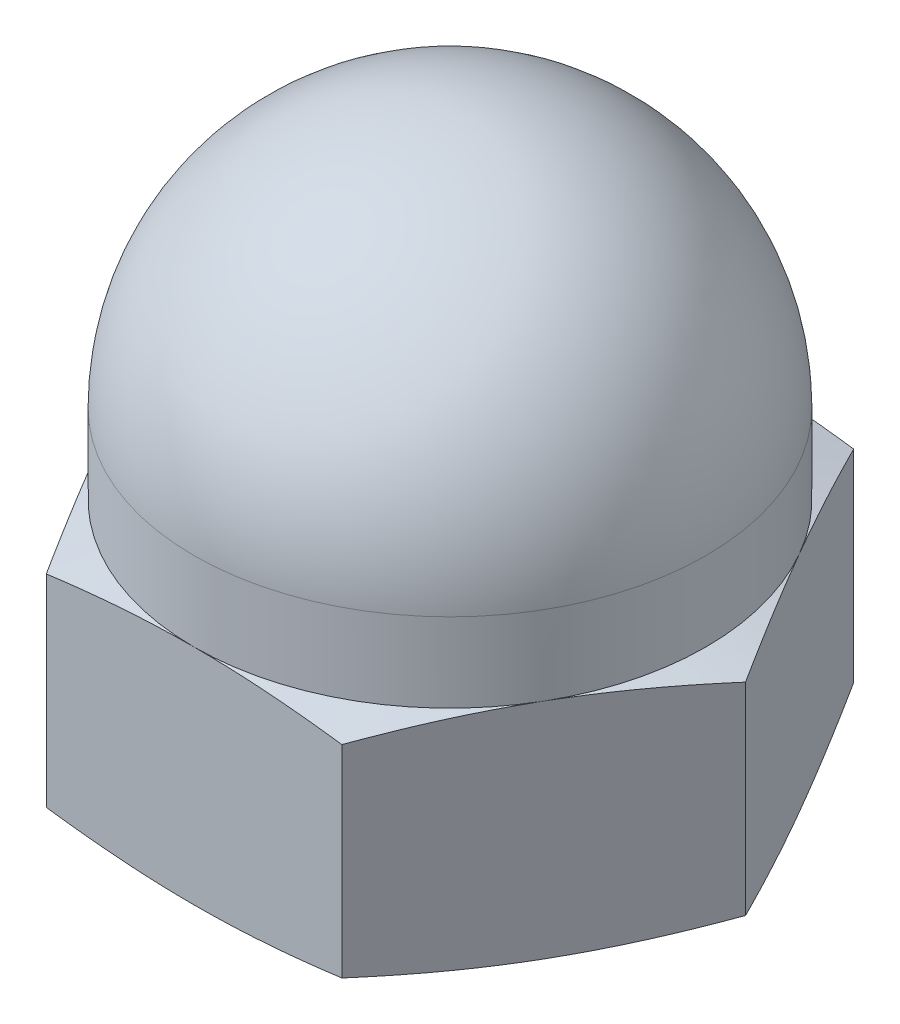
ISO-10303-21;
HEADER;
FILE_DESCRIPTION(('STEP AP214'),'2;1');
FILE_NAME('part.step','',(''),(''),'','','');
FILE_SCHEMA(('AUTOMOTIVE_DESIGN { 1 0 10303 214 1 1 1 1 }'));
ENDSEC;
DATA;
#1=APPLICATION_CONTEXT('core data for automotive mechanical design processes');
#2=APPLICATION_PROTOCOL_DEFINITION('international standard','automotive_design',2000,#1);
#3=PRODUCT_CONTEXT('',#1,'mechanical');
#4=PRODUCT('Part','Part','',(#3));
#5=PRODUCT_RELATED_PRODUCT_CATEGORY('part','',(#4));
#6=PRODUCT_DEFINITION_FORMATION('','',#4);
#7=PRODUCT_DEFINITION_CONTEXT('part definition',#1,'design');
#8=PRODUCT_DEFINITION('design','',#6,#7);
#9=PRODUCT_DEFINITION_SHAPE('','',#8);
#10=(LENGTH_UNIT() NAMED_UNIT(*) SI_UNIT(.MILLI.,.METRE.));
#11=(NAMED_UNIT(*) PLANE_ANGLE_UNIT() SI_UNIT($,.RADIAN.));
#12=(NAMED_UNIT(*) SI_UNIT($,.STERADIAN.) SOLID_ANGLE_UNIT());
#13=UNCERTAINTY_MEASURE_WITH_UNIT(LENGTH_MEASURE(1.E-05),#10,'distance_accuracy_value','');
#14=(GEOMETRIC_REPRESENTATION_CONTEXT(3) GLOBAL_UNCERTAINTY_ASSIGNED_CONTEXT((#13)) GLOBAL_UNIT_ASSIGNED_CONTEXT((#10,
#11,#12)) REPRESENTATION_CONTEXT('',''));
#15=CARTESIAN_POINT('',(0.,0.,0.));
#16=DIRECTION('',(0.,0.,1.));
#17=DIRECTION('',(1.,0.,0.));
#18=AXIS2_PLACEMENT_3D('',#15,#16,#17);
#19=CARTESIAN_POINT('',(0.,0.,0.));
#20=DIRECTION('',(0.,1.,0.));
#21=DIRECTION('',(1.,0.,0.));
#22=AXIS2_PLACEMENT_3D('',#19,#20,#21);
#23=PLANE('',#22);
#24=CARTESIAN_POINT('',(0.,0.,0.));
#25=DIRECTION('',(0.,1.,0.));
#26=DIRECTION('',(1.,0.,0.));
#27=AXIS2_PLACEMENT_3D('',#24,#25,#26);
#28=CIRCLE('',#27,1.2295);
#29=CARTESIAN_POINT('',(-1.2295,0.,0.));
#30=VERTEX_POINT('',#29);
#31=EDGE_CURVE('E428',#30,#30,#28,.T.);
#32=ORIENTED_EDGE('',*,*,#31,.T.);
#33=EDGE_LOOP('',(#32));
#34=FACE_BOUND('',#33,.T.);
#35=CARTESIAN_POINT('',(0.,0.,0.));
#36=DIRECTION('',(0.,-1.,0.));
#37=DIRECTION('',(-1.,0.,0.));
#38=AXIS2_PLACEMENT_3D('',#35,#36,#37);
#39=CIRCLE('',#38,2.75);
#40=CARTESIAN_POINT('',(2.38156986040721,0.,1.375));
#41=VERTEX_POINT('',#40);
#42=CARTESIAN_POINT('',(0.,0.,2.75));
#43=VERTEX_POINT('',#42);
#44=EDGE_CURVE('E366',#41,#43,#39,.T.);
#45=ORIENTED_EDGE('',*,*,#44,.T.);
#46=CARTESIAN_POINT('',(0.,0.,0.));
#47=DIRECTION('',(0.,-1.,0.));
#48=DIRECTION('',(-1.,0.,0.));
#49=AXIS2_PLACEMENT_3D('',#46,#47,#48);
#50=CIRCLE('',#49,2.75);
#51=CARTESIAN_POINT('',(-2.38156986040721,0.,1.375));
#52=VERTEX_POINT('',#51);
#53=EDGE_CURVE('E298',#43,#52,#50,.T.);
#54=ORIENTED_EDGE('',*,*,#53,.T.);
#55=CARTESIAN_POINT('',(0.,0.,0.));
#56=DIRECTION('',(0.,-1.,0.));
#57=DIRECTION('',(-1.,0.,0.));
#58=AXIS2_PLACEMENT_3D('',#55,#56,#57);
#59=CIRCLE('',#58,2.75);
#60=CARTESIAN_POINT('',(-2.38156986040721,0.,-1.375));
#61=VERTEX_POINT('',#60);
#62=EDGE_CURVE('E213',#52,#61,#59,.T.);
#63=ORIENTED_EDGE('',*,*,#62,.T.);
#64=CARTESIAN_POINT('',(0.,0.,0.));
#65=DIRECTION('',(0.,-1.,0.));
#66=DIRECTION('',(-1.,0.,0.));
#67=AXIS2_PLACEMENT_3D('',#64,#65,#66);
#68=CIRCLE('',#67,2.75);
#69=CARTESIAN_POINT('',(0.,0.,-2.75));
#70=VERTEX_POINT('',#69);
#71=EDGE_CURVE('E184',#61,#70,#68,.T.);
#72=ORIENTED_EDGE('',*,*,#71,.T.);
#73=CARTESIAN_POINT('',(0.,0.,0.));
#74=DIRECTION('',(0.,-1.,0.));
#75=DIRECTION('',(-1.,0.,0.));
#76=AXIS2_PLACEMENT_3D('',#73,#74,#75);
#77=CIRCLE('',#76,2.75);
#78=CARTESIAN_POINT('',(2.38156986040721,0.,-1.375));
#79=VERTEX_POINT('',#78);
#80=EDGE_CURVE('E354',#70,#79,#77,.T.);
#81=ORIENTED_EDGE('',*,*,#80,.T.);
#82=CARTESIAN_POINT('',(0.,0.,0.));
#83=DIRECTION('',(0.,-1.,0.));
#84=DIRECTION('',(-1.,0.,0.));
#85=AXIS2_PLACEMENT_3D('',#82,#83,#84);
#86=CIRCLE('',#85,2.75);
#87=EDGE_CURVE('E273',#79,#41,#86,.T.);
#88=ORIENTED_EDGE('',*,*,#87,.T.);
#89=EDGE_LOOP('',(#45,#54,#63,#72,#81,#88));
#90=FACE_BOUND('',#89,.T.);
#91=ADVANCED_FACE('F16',(#34,#90),#23,.F.);
#92=CARTESIAN_POINT('',(-1.58771324027147,0.,2.75));
#93=DIRECTION('',(0.,0.,1.));
#94=DIRECTION('',(1.,0.,0.));
#95=AXIS2_PLACEMENT_3D('',#92,#93,#94);
#96=PLANE('',#95);
#97=CARTESIAN_POINT('',(0.,2.4,2.75));
#98=CARTESIAN_POINT('',(-0.736860279185574,2.4,2.75000000000001));
#99=CARTESIAN_POINT('',(-1.58771324027146,2.2860073180997,2.75));
#100=(BOUNDED_CURVE() B_SPLINE_CURVE(2,(#97,#98,#99),.UNSPECIFIED.,.F.,
.F.) B_SPLINE_CURVE_WITH_KNOTS((3,3),(0.159270877483225,0.31854175496645),
.UNSPECIFIED.) CURVE() GEOMETRIC_REPRESENTATION_ITEM() RATIONAL_B_SPLINE_CURVE((1.,
1.03795484930204,1.)) REPRESENTATION_ITEM(''));
#101=CARTESIAN_POINT('',(0.,2.4,2.75));
#102=VERTEX_POINT('',#101);
#103=CARTESIAN_POINT('',(-1.58771324027147,2.2860073180997,2.75));
#104=VERTEX_POINT('',#103);
#105=EDGE_CURVE('E345',#102,#104,#100,.T.);
#106=ORIENTED_EDGE('',*,*,#105,.T.);
#107=DIRECTION('',(0.,1.,0.));
#108=VECTOR('',#107,1.);
#109=CARTESIAN_POINT('',(-1.58771324027147,0.,2.75));
#110=LINE('',#109,#108);
#111=CARTESIAN_POINT('',(-1.58771324027147,0.113992681900296,2.75));
#112=VERTEX_POINT('',#111);
#113=EDGE_CURVE('E150',#112,#104,#110,.T.);
#114=ORIENTED_EDGE('',*,*,#113,.F.);
#115=CARTESIAN_POINT('',(-1.58771324027146,0.113992681900296,2.75));
#116=CARTESIAN_POINT('',(-0.736860279185583,0.,2.75000000000001));
#117=CARTESIAN_POINT('',(0.,0.,2.75));
#118=(BOUNDED_CURVE() B_SPLINE_CURVE(2,(#115,#116,#117),.UNSPECIFIED.,.F.,
.F.) B_SPLINE_CURVE_WITH_KNOTS((3,3),(0.,0.159270877483225),
.UNSPECIFIED.) CURVE() GEOMETRIC_REPRESENTATION_ITEM() RATIONAL_B_SPLINE_CURVE((1.,
1.03795484930203,1.)) REPRESENTATION_ITEM(''));
#119=EDGE_CURVE('E142',#112,#43,#118,.T.);
#120=ORIENTED_EDGE('',*,*,#119,.T.);
#121=CARTESIAN_POINT('',(0.,0.,2.75));
#122=CARTESIAN_POINT('',(0.736860279185586,0.,2.75));
#123=CARTESIAN_POINT('',(1.58771324027146,0.113992681900296,2.75));
#124=(BOUNDED_CURVE() B_SPLINE_CURVE(2,(#121,#122,#123),.UNSPECIFIED.,.F.,
.F.) B_SPLINE_CURVE_WITH_KNOTS((3,3),(0.159270877483225,0.31854175496645),
.UNSPECIFIED.) CURVE() GEOMETRIC_REPRESENTATION_ITEM() RATIONAL_B_SPLINE_CURVE((1.,
1.03795484930204,1.)) REPRESENTATION_ITEM(''));
#125=CARTESIAN_POINT('',(1.58771324027148,0.113992681900296,2.75));
#126=VERTEX_POINT('',#125);
#127=EDGE_CURVE('E373',#43,#126,#124,.T.);
#128=ORIENTED_EDGE('',*,*,#127,.T.);
#129=DIRECTION('',(0.,1.,0.));
#130=VECTOR('',#129,1.);
#131=CARTESIAN_POINT('',(1.58771324027147,0.,2.75));
#132=LINE('',#131,#130);
#133=CARTESIAN_POINT('',(1.58771324027148,2.2860073180997,2.75));
#134=VERTEX_POINT('',#133);
#135=EDGE_CURVE('E11',#126,#134,#132,.T.);
#136=ORIENTED_EDGE('',*,*,#135,.T.);
#137=CARTESIAN_POINT('',(1.58771324027146,2.2860073180997,2.75));
#138=CARTESIAN_POINT('',(0.736860279185576,2.4,2.75));
#139=CARTESIAN_POINT('',(0.,2.4,2.75));
#140=(BOUNDED_CURVE() B_SPLINE_CURVE(2,(#137,#138,#139),.UNSPECIFIED.,.F.,
.F.) B_SPLINE_CURVE_WITH_KNOTS((3,3),(0.,0.159270877483225),
.UNSPECIFIED.) CURVE() GEOMETRIC_REPRESENTATION_ITEM() RATIONAL_B_SPLINE_CURVE((1.,
1.03795484930205,1.)) REPRESENTATION_ITEM(''));
#141=EDGE_CURVE('E221',#134,#102,#140,.T.);
#142=ORIENTED_EDGE('',*,*,#141,.T.);
#143=EDGE_LOOP('',(#106,#114,#120,#128,#136,#142));
#144=FACE_BOUND('',#143,.T.);
#145=ADVANCED_FACE('F497',(#144),#96,.T.);
#146=CARTESIAN_POINT('',(1.58771324027147,0.,2.75));
#147=DIRECTION('',(0.866025403784439,0.,0.5));
#148=DIRECTION('',(0.,-1.,0.));
#149=AXIS2_PLACEMENT_3D('',#146,#147,#148);
#150=PLANE('',#149);
#151=CARTESIAN_POINT('',(2.38156986040721,2.4,1.375));
#152=CARTESIAN_POINT('',(2.01313972081441,2.4,2.01313972081442));
#153=CARTESIAN_POINT('',(1.58771324027148,2.2860073180997,2.75));
#154=(BOUNDED_CURVE() B_SPLINE_CURVE(2,(#151,#152,#153),.UNSPECIFIED.,.F.,
.F.) B_SPLINE_CURVE_WITH_KNOTS((3,3),(0.159270877483225,0.31854175496645),
.UNSPECIFIED.) CURVE() GEOMETRIC_REPRESENTATION_ITEM() RATIONAL_B_SPLINE_CURVE((1.,
1.03795484930203,1.)) REPRESENTATION_ITEM(''));
#155=CARTESIAN_POINT('',(2.38156986040721,2.4,1.375));
#156=VERTEX_POINT('',#155);
#157=EDGE_CURVE('E227',#156,#134,#154,.T.);
#158=ORIENTED_EDGE('',*,*,#157,.T.);
#159=ORIENTED_EDGE('',*,*,#135,.F.);
#160=CARTESIAN_POINT('',(1.58771324027148,0.113992681900296,2.75));
#161=CARTESIAN_POINT('',(2.01313972081442,0.,2.01313972081441));
#162=CARTESIAN_POINT('',(2.38156986040721,0.,1.375));
#163=(BOUNDED_CURVE() B_SPLINE_CURVE(2,(#160,#161,#162),.UNSPECIFIED.,.F.,
.F.) B_SPLINE_CURVE_WITH_KNOTS((3,3),(0.,0.159270877483225),
.UNSPECIFIED.) CURVE() GEOMETRIC_REPRESENTATION_ITEM() RATIONAL_B_SPLINE_CURVE((1.,
1.03795484930204,1.)) REPRESENTATION_ITEM(''));
#164=EDGE_CURVE('E325',#126,#41,#163,.T.);
#165=ORIENTED_EDGE('',*,*,#164,.T.);
#166=CARTESIAN_POINT('',(2.38156986040721,0.,1.375));
#167=CARTESIAN_POINT('',(2.75,0.,0.736860279185588));
#168=CARTESIAN_POINT('',(3.17542648054294,0.113992681900296,0.));
#169=(BOUNDED_CURVE() B_SPLINE_CURVE(2,(#166,#167,#168),.UNSPECIFIED.,.F.,
.F.) B_SPLINE_CURVE_WITH_KNOTS((3,3),(0.159270877483225,0.31854175496645),
.UNSPECIFIED.) CURVE() GEOMETRIC_REPRESENTATION_ITEM() RATIONAL_B_SPLINE_CURVE((1.,
1.03795484930205,1.)) REPRESENTATION_ITEM(''));
#170=CARTESIAN_POINT('',(3.17542648054294,0.113992681900296,0.));
#171=VERTEX_POINT('',#170);
#172=EDGE_CURVE('E264',#41,#171,#169,.T.);
#173=ORIENTED_EDGE('',*,*,#172,.T.);
#174=DIRECTION('',(0.,1.,0.));
#175=VECTOR('',#174,1.);
#176=CARTESIAN_POINT('',(3.17542648054294,0.,0.));
#177=LINE('',#176,#175);
#178=CARTESIAN_POINT('',(3.17542648054294,2.2860073180997,0.));
#179=VERTEX_POINT('',#178);
#180=EDGE_CURVE('E377',#171,#179,#177,.T.);
#181=ORIENTED_EDGE('',*,*,#180,.T.);
#182=CARTESIAN_POINT('',(3.17542648054294,2.2860073180997,0.));
#183=CARTESIAN_POINT('',(2.75000000000001,2.4,0.736860279185583));
#184=CARTESIAN_POINT('',(2.38156986040721,2.4,1.375));
#185=(BOUNDED_CURVE() B_SPLINE_CURVE(2,(#182,#183,#184),.UNSPECIFIED.,.F.,
.F.) B_SPLINE_CURVE_WITH_KNOTS((3,3),(0.,0.159270877483225),
.UNSPECIFIED.) CURVE() GEOMETRIC_REPRESENTATION_ITEM() RATIONAL_B_SPLINE_CURVE((1.,
1.03795484930204,1.)) REPRESENTATION_ITEM(''));
#186=EDGE_CURVE('E194',#179,#156,#185,.T.);
#187=ORIENTED_EDGE('',*,*,#186,.T.);
#188=EDGE_LOOP('',(#158,#159,#165,#173,#181,#187));
#189=FACE_BOUND('',#188,.T.);
#190=ADVANCED_FACE('F503',(#189),#150,.T.);
#191=CARTESIAN_POINT('',(0.,3.25,0.));
#192=DIRECTION('',(0.,1.,0.));
#193=DIRECTION('',(0.,0.,-1.));
#194=AXIS2_PLACEMENT_3D('',#191,#192,#193);
#195=SPHERICAL_SURFACE('',#194,2.75);
#196=CARTESIAN_POINT('',(0.,3.25,0.));
#197=DIRECTION('',(0.,1.,0.));
#198=DIRECTION('',(1.,0.,0.));
#199=AXIS2_PLACEMENT_3D('',#196,#197,#198);
#200=CIRCLE('',#199,2.75);
#201=CARTESIAN_POINT('',(2.75,3.25,0.));
#202=VERTEX_POINT('',#201);
#203=CARTESIAN_POINT('',(0.,3.25,2.75));
#204=VERTEX_POINT('',#203);
#205=EDGE_CURVE('E214',#202,#204,#200,.T.);
#206=ORIENTED_EDGE('',*,*,#205,.T.);
#207=CARTESIAN_POINT('',(0.,3.25,0.));
#208=DIRECTION('',(1.,0.,0.));
#209=DIRECTION('',(0.,0.,1.));
#210=AXIS2_PLACEMENT_3D('',#207,#208,#209);
#211=CIRCLE('',#210,2.75);
#212=CARTESIAN_POINT('',(0.,6.,0.));
#213=VERTEX_POINT('',#212);
#214=EDGE_CURVE('E27',#213,#204,#211,.T.);
#215=ORIENTED_EDGE('',*,*,#214,.F.);
#216=ORIENTED_EDGE('',*,*,#214,.T.);
#217=CARTESIAN_POINT('',(0.,3.25,0.));
#218=DIRECTION('',(0.,1.,0.));
#219=DIRECTION('',(1.,0.,0.));
#220=AXIS2_PLACEMENT_3D('',#217,#218,#219);
#221=CIRCLE('',#220,2.75);
#222=EDGE_CURVE('E247',#204,#202,#221,.T.);
#223=ORIENTED_EDGE('',*,*,#222,.T.);
#224=EDGE_LOOP('',(#206,#215,#216,#223));
#225=FACE_BOUND('',#224,.T.);
#226=ADVANCED_FACE('F521',(#225),#195,.T.);
#227=CARTESIAN_POINT('',(0.,2.825,0.));
#228=DIRECTION('',(0.,1.,0.));
#229=DIRECTION('',(-1.,0.,0.));
#230=AXIS2_PLACEMENT_3D('',#227,#228,#229);
#231=CYLINDRICAL_SURFACE('',#230,2.75);
#232=ORIENTED_EDGE('',*,*,#205,.F.);
#233=DIRECTION('',(0.,-1.,0.));
#234=VECTOR('',#233,1.);
#235=CARTESIAN_POINT('',(2.75,2.825,0.));
#236=LINE('',#235,#234);
#237=CARTESIAN_POINT('',(2.75,2.4,0.));
#238=VERTEX_POINT('',#237);
#239=EDGE_CURVE('E219',#202,#238,#236,.T.);
#240=ORIENTED_EDGE('',*,*,#239,.T.);
#241=CARTESIAN_POINT('',(0.,2.4,0.));
#242=DIRECTION('',(0.,-1.,0.));
#243=DIRECTION('',(-1.,0.,0.));
#244=AXIS2_PLACEMENT_3D('',#241,#242,#243);
#245=CIRCLE('',#244,2.75);
#246=CARTESIAN_POINT('',(2.38156986040721,2.4,-1.375));
#247=VERTEX_POINT('',#246);
#248=EDGE_CURVE('E286',#247,#238,#245,.T.);
#249=ORIENTED_EDGE('',*,*,#248,.F.);
#250=CARTESIAN_POINT('',(0.,2.4,0.));
#251=DIRECTION('',(0.,-1.,0.));
#252=DIRECTION('',(-1.,0.,0.));
#253=AXIS2_PLACEMENT_3D('',#250,#251,#252);
#254=CIRCLE('',#253,2.75);
#255=CARTESIAN_POINT('',(0.,2.4,-2.75));
#256=VERTEX_POINT('',#255);
#257=EDGE_CURVE('E207',#256,#247,#254,.T.);
#258=ORIENTED_EDGE('',*,*,#257,.F.);
#259=CARTESIAN_POINT('',(0.,2.4,0.));
#260=DIRECTION('',(0.,-1.,0.));
#261=DIRECTION('',(-1.,0.,0.));
#262=AXIS2_PLACEMENT_3D('',#259,#260,#261);
#263=CIRCLE('',#262,2.75);
#264=CARTESIAN_POINT('',(-2.3815698604072,2.4,-1.375));
#265=VERTEX_POINT('',#264);
#266=EDGE_CURVE('E191',#265,#256,#263,.T.);
#267=ORIENTED_EDGE('',*,*,#266,.F.);
#268=CARTESIAN_POINT('',(0.,2.4,0.));
#269=DIRECTION('',(0.,-1.,0.));
#270=DIRECTION('',(-1.,0.,0.));
#271=AXIS2_PLACEMENT_3D('',#268,#269,#270);
#272=CIRCLE('',#271,2.75);
#273=CARTESIAN_POINT('',(-2.38156986040721,2.4,1.375));
#274=VERTEX_POINT('',#273);
#275=EDGE_CURVE('E389',#274,#265,#272,.T.);
#276=ORIENTED_EDGE('',*,*,#275,.F.);
#277=CARTESIAN_POINT('',(0.,2.4,0.));
#278=DIRECTION('',(0.,-1.,0.));
#279=DIRECTION('',(-1.,0.,0.));
#280=AXIS2_PLACEMENT_3D('',#277,#278,#279);
#281=CIRCLE('',#280,2.75);
#282=EDGE_CURVE('E416',#102,#274,#281,.T.);
#283=ORIENTED_EDGE('',*,*,#282,.F.);
#284=CARTESIAN_POINT('',(0.,2.4,0.));
#285=DIRECTION('',(0.,-1.,0.));
#286=DIRECTION('',(-1.,0.,0.));
#287=AXIS2_PLACEMENT_3D('',#284,#285,#286);
#288=CIRCLE('',#287,2.75);
#289=EDGE_CURVE('E263',#156,#102,#288,.T.);
#290=ORIENTED_EDGE('',*,*,#289,.F.);
#291=CARTESIAN_POINT('',(0.,2.4,0.));
#292=DIRECTION('',(0.,-1.,0.));
#293=DIRECTION('',(-1.,0.,0.));
#294=AXIS2_PLACEMENT_3D('',#291,#292,#293);
#295=CIRCLE('',#294,2.75);
#296=EDGE_CURVE('E228',#238,#156,#295,.T.);
#297=ORIENTED_EDGE('',*,*,#296,.F.);
#298=ORIENTED_EDGE('',*,*,#239,.F.);
#299=ORIENTED_EDGE('',*,*,#222,.F.);
#300=EDGE_LOOP('',(#232,#240,#249,#258,#267,#276,#283,#290,#297,#298,#299));
#301=FACE_BOUND('',#300,.T.);
#302=ADVANCED_FACE('F517',(#301),#231,.T.);
#303=CARTESIAN_POINT('',(0.,4.5,0.));
#304=DIRECTION('',(0.,-1.,0.));
#305=DIRECTION('',(0.,0.,-1.));
#306=AXIS2_PLACEMENT_3D('',#303,#304,#305);
#307=PLANE('',#306);
#308=CARTESIAN_POINT('',(0.,4.5,0.));
#309=DIRECTION('',(0.,-1.,0.));
#310=DIRECTION('',(1.,0.,0.));
#311=AXIS2_PLACEMENT_3D('',#308,#309,#310);
#312=CIRCLE('',#311,1.2295);
#313=CARTESIAN_POINT('',(-1.2295,4.5,0.));
#314=VERTEX_POINT('',#313);
#315=EDGE_CURVE('E220',#314,#314,#312,.T.);
#316=ORIENTED_EDGE('',*,*,#315,.T.);
#317=EDGE_LOOP('',(#316));
#318=FACE_BOUND('',#317,.T.);
#319=ADVANCED_FACE('F520',(#318),#307,.T.);
#320=CARTESIAN_POINT('',(0.,2.25,0.));
#321=DIRECTION('',(0.,-1.,0.));
#322=DIRECTION('',(1.,0.,0.));
#323=AXIS2_PLACEMENT_3D('',#320,#321,#322);
#324=CYLINDRICAL_SURFACE('',#323,1.2295);
#325=ORIENTED_EDGE('',*,*,#31,.F.);
#326=DIRECTION('',(0.,1.,0.));
#327=VECTOR('',#326,1.);
#328=CARTESIAN_POINT('',(-1.2295,2.25,0.));
#329=LINE('',#328,#327);
#330=EDGE_CURVE('E20',#30,#314,#329,.T.);
#331=ORIENTED_EDGE('',*,*,#330,.T.);
#332=ORIENTED_EDGE('',*,*,#315,.F.);
#333=ORIENTED_EDGE('',*,*,#330,.F.);
#334=EDGE_LOOP('',(#325,#331,#332,#333));
#335=FACE_BOUND('',#334,.T.);
#336=ADVANCED_FACE('F529',(#335),#324,.F.);
#337=CARTESIAN_POINT('',(3.17542648054294,0.,0.));
#338=DIRECTION('',(0.866025403784438,0.,-0.5));
#339=DIRECTION('',(0.,-1.,0.));
#340=AXIS2_PLACEMENT_3D('',#337,#338,#339);
#341=PLANE('',#340);
#342=CARTESIAN_POINT('',(1.58771324027147,2.2860073180997,-2.75));
#343=CARTESIAN_POINT('',(2.01313972081441,2.4,-2.01313972081442));
#344=CARTESIAN_POINT('',(2.38156986040721,2.4,-1.375));
#345=(BOUNDED_CURVE() B_SPLINE_CURVE(2,(#342,#343,#344),.UNSPECIFIED.,.F.,
.F.) B_SPLINE_CURVE_WITH_KNOTS((3,3),(0.,0.159270877483225),
.UNSPECIFIED.) CURVE() GEOMETRIC_REPRESENTATION_ITEM() RATIONAL_B_SPLINE_CURVE((1.,
1.03795484930206,1.)) REPRESENTATION_ITEM(''));
#346=CARTESIAN_POINT('',(1.58771324027147,2.2860073180997,-2.75));
#347=VERTEX_POINT('',#346);
#348=EDGE_CURVE('E198',#347,#247,#345,.T.);
#349=ORIENTED_EDGE('',*,*,#348,.T.);
#350=CARTESIAN_POINT('',(2.38156986040721,2.4,-1.375));
#351=CARTESIAN_POINT('',(2.75,2.4,-0.736860279185588));
#352=CARTESIAN_POINT('',(3.17542648054294,2.2860073180997,0.));
#353=(BOUNDED_CURVE() B_SPLINE_CURVE(2,(#350,#351,#352),.UNSPECIFIED.,.F.,
.F.) B_SPLINE_CURVE_WITH_KNOTS((3,3),(0.159270877483225,0.318541754966451),
.UNSPECIFIED.) CURVE() GEOMETRIC_REPRESENTATION_ITEM() RATIONAL_B_SPLINE_CURVE((1.,
1.03795484930205,1.)) REPRESENTATION_ITEM(''));
#354=EDGE_CURVE('E280',#247,#179,#353,.T.);
#355=ORIENTED_EDGE('',*,*,#354,.T.);
#356=ORIENTED_EDGE('',*,*,#180,.F.);
#357=CARTESIAN_POINT('',(3.17542648054294,0.113992681900296,0.));
#358=CARTESIAN_POINT('',(2.75,0.,-0.736860279185591));
#359=CARTESIAN_POINT('',(2.38156986040721,0.,-1.375));
#360=(BOUNDED_CURVE() B_SPLINE_CURVE(2,(#357,#358,#359),.UNSPECIFIED.,.F.,
.F.) B_SPLINE_CURVE_WITH_KNOTS((3,3),(0.,0.159270877483226),
.UNSPECIFIED.) CURVE() GEOMETRIC_REPRESENTATION_ITEM() RATIONAL_B_SPLINE_CURVE((1.,
1.03795484930203,1.)) REPRESENTATION_ITEM(''));
#361=EDGE_CURVE('E274',#171,#79,#360,.T.);
#362=ORIENTED_EDGE('',*,*,#361,.T.);
#363=CARTESIAN_POINT('',(2.38156986040721,0.,-1.375));
#364=CARTESIAN_POINT('',(2.01313972081441,0.,-2.01313972081441));
#365=CARTESIAN_POINT('',(1.58771324027147,0.113992681900296,-2.75));
#366=(BOUNDED_CURVE() B_SPLINE_CURVE(2,(#363,#364,#365),.UNSPECIFIED.,.F.,
.F.) B_SPLINE_CURVE_WITH_KNOTS((3,3),(0.159270877483226,0.318541754966451),
.UNSPECIFIED.) CURVE() GEOMETRIC_REPRESENTATION_ITEM() RATIONAL_B_SPLINE_CURVE((1.,
1.03795484930203,1.)) REPRESENTATION_ITEM(''));
#367=CARTESIAN_POINT('',(1.58771324027147,0.113992681900296,-2.75));
#368=VERTEX_POINT('',#367);
#369=EDGE_CURVE('E336',#79,#368,#366,.T.);
#370=ORIENTED_EDGE('',*,*,#369,.T.);
#371=DIRECTION('',(0.,1.,0.));
#372=VECTOR('',#371,1.);
#373=CARTESIAN_POINT('',(1.58771324027147,0.,-2.75));
#374=LINE('',#373,#372);
#375=EDGE_CURVE('E355',#368,#347,#374,.T.);
#376=ORIENTED_EDGE('',*,*,#375,.T.);
#377=EDGE_LOOP('',(#349,#355,#356,#362,#370,#376));
#378=FACE_BOUND('',#377,.T.);
#379=ADVANCED_FACE('F472',(#378),#341,.T.);
#380=CARTESIAN_POINT('',(-3.17542648054294,0.,0.));
#381=DIRECTION('',(-0.866025403784438,0.,0.5));
#382=DIRECTION('',(0.,1.,0.));
#383=AXIS2_PLACEMENT_3D('',#380,#381,#382);
#384=PLANE('',#383);
#385=CARTESIAN_POINT('',(-1.58771324027147,2.2860073180997,2.75));
#386=CARTESIAN_POINT('',(-2.01313972081442,2.4,2.01313972081441));
#387=CARTESIAN_POINT('',(-2.38156986040721,2.4,1.375));
#388=(BOUNDED_CURVE() B_SPLINE_CURVE(2,(#385,#386,#387),.UNSPECIFIED.,.F.,
.F.) B_SPLINE_CURVE_WITH_KNOTS((3,3),(0.,0.159270877483225),
.UNSPECIFIED.) CURVE() GEOMETRIC_REPRESENTATION_ITEM() RATIONAL_B_SPLINE_CURVE((1.,
1.03795484930204,1.)) REPRESENTATION_ITEM(''));
#389=EDGE_CURVE('E337',#104,#274,#388,.T.);
#390=ORIENTED_EDGE('',*,*,#389,.T.);
#391=CARTESIAN_POINT('',(-2.38156986040721,2.4,1.375));
#392=CARTESIAN_POINT('',(-2.75,2.4,0.736860279185595));
#393=CARTESIAN_POINT('',(-3.17542648054294,2.2860073180997,0.));
#394=(BOUNDED_CURVE() B_SPLINE_CURVE(2,(#391,#392,#393),.UNSPECIFIED.,.F.,
.F.) B_SPLINE_CURVE_WITH_KNOTS((3,3),(0.159270877483225,0.31854175496645),
.UNSPECIFIED.) CURVE() GEOMETRIC_REPRESENTATION_ITEM() RATIONAL_B_SPLINE_CURVE((1.,
1.03795484930202,1.)) REPRESENTATION_ITEM(''));
#395=CARTESIAN_POINT('',(-3.17542648054294,2.2860073180997,0.));
#396=VERTEX_POINT('',#395);
#397=EDGE_CURVE('E454',#274,#396,#394,.T.);
#398=ORIENTED_EDGE('',*,*,#397,.T.);
#399=DIRECTION('',(0.,1.,0.));
#400=VECTOR('',#399,1.);
#401=CARTESIAN_POINT('',(-3.17542648054294,0.,0.));
#402=LINE('',#401,#400);
#403=CARTESIAN_POINT('',(-3.17542648054294,0.113992681900296,0.));
#404=VERTEX_POINT('',#403);
#405=EDGE_CURVE('E160',#404,#396,#402,.T.);
#406=ORIENTED_EDGE('',*,*,#405,.F.);
#407=CARTESIAN_POINT('',(-3.17542648054294,0.113992681900296,0.));
#408=CARTESIAN_POINT('',(-2.75,0.,0.736860279185584));
#409=CARTESIAN_POINT('',(-2.38156986040721,0.,1.375));
#410=(BOUNDED_CURVE() B_SPLINE_CURVE(2,(#407,#408,#409),.UNSPECIFIED.,.F.,
.F.) B_SPLINE_CURVE_WITH_KNOTS((3,3),(0.,0.159270877483225),
.UNSPECIFIED.) CURVE() GEOMETRIC_REPRESENTATION_ITEM() RATIONAL_B_SPLINE_CURVE((1.,
1.03795484930204,1.)) REPRESENTATION_ITEM(''));
#411=EDGE_CURVE('E237',#404,#52,#410,.T.);
#412=ORIENTED_EDGE('',*,*,#411,.T.);
#413=CARTESIAN_POINT('',(-2.38156986040721,0.,1.375));
#414=CARTESIAN_POINT('',(-2.01313972081441,0.,2.01313972081442));
#415=CARTESIAN_POINT('',(-1.58771324027147,0.113992681900296,2.75));
#416=(BOUNDED_CURVE() B_SPLINE_CURVE(2,(#413,#414,#415),.UNSPECIFIED.,.F.,
.F.) B_SPLINE_CURVE_WITH_KNOTS((3,3),(0.159270877483225,0.318541754966451),
.UNSPECIFIED.) CURVE() GEOMETRIC_REPRESENTATION_ITEM() RATIONAL_B_SPLINE_CURVE((1.,
1.03795484930203,1.)) REPRESENTATION_ITEM(''));
#417=EDGE_CURVE('E292',#52,#112,#416,.T.);
#418=ORIENTED_EDGE('',*,*,#417,.T.);
#419=ORIENTED_EDGE('',*,*,#113,.T.);
#420=EDGE_LOOP('',(#390,#398,#406,#412,#418,#419));
#421=FACE_BOUND('',#420,.T.);
#422=ADVANCED_FACE('F402',(#421),#384,.T.);
#423=CARTESIAN_POINT('',(1.58771324027147,0.,-2.75));
#424=DIRECTION('',(0.,0.,-1.));
#425=DIRECTION('',(-1.,0.,0.));
#426=AXIS2_PLACEMENT_3D('',#423,#424,#425);
#427=PLANE('',#426);
#428=CARTESIAN_POINT('',(-1.58771324027148,2.2860073180997,-2.75));
#429=CARTESIAN_POINT('',(-0.736860279185591,2.4,-2.75));
#430=CARTESIAN_POINT('',(0.,2.4,-2.75));
#431=(BOUNDED_CURVE() B_SPLINE_CURVE(2,(#428,#429,#430),.UNSPECIFIED.,.F.,
.F.) B_SPLINE_CURVE_WITH_KNOTS((3,3),(0.,0.159270877483226),
.UNSPECIFIED.) CURVE() GEOMETRIC_REPRESENTATION_ITEM() RATIONAL_B_SPLINE_CURVE((1.,
1.03795484930208,1.)) REPRESENTATION_ITEM(''));
#432=CARTESIAN_POINT('',(-1.58771324027147,2.2860073180997,-2.75));
#433=VERTEX_POINT('',#432);
#434=EDGE_CURVE('E176',#433,#256,#431,.T.);
#435=ORIENTED_EDGE('',*,*,#434,.T.);
#436=CARTESIAN_POINT('',(0.,2.4,-2.75));
#437=CARTESIAN_POINT('',(0.736860279185587,2.4,-2.75));
#438=CARTESIAN_POINT('',(1.58771324027147,2.2860073180997,-2.75));
#439=(BOUNDED_CURVE() B_SPLINE_CURVE(2,(#436,#437,#438),.UNSPECIFIED.,.F.,
.F.) B_SPLINE_CURVE_WITH_KNOTS((3,3),(0.159270877483226,0.318541754966452),
.UNSPECIFIED.) CURVE() GEOMETRIC_REPRESENTATION_ITEM() RATIONAL_B_SPLINE_CURVE((1.,
1.03795484930207,1.)) REPRESENTATION_ITEM(''));
#440=EDGE_CURVE('E319',#256,#347,#439,.T.);
#441=ORIENTED_EDGE('',*,*,#440,.T.);
#442=ORIENTED_EDGE('',*,*,#375,.F.);
#443=CARTESIAN_POINT('',(1.58771324027148,0.113992681900296,-2.75));
#444=CARTESIAN_POINT('',(0.736860279185585,0.,-2.75));
#445=CARTESIAN_POINT('',(0.,0.,-2.75));
#446=(BOUNDED_CURVE() B_SPLINE_CURVE(2,(#443,#444,#445),.UNSPECIFIED.,.F.,
.F.) B_SPLINE_CURVE_WITH_KNOTS((3,3),(0.,0.159270877483226),
.UNSPECIFIED.) CURVE() GEOMETRIC_REPRESENTATION_ITEM() RATIONAL_B_SPLINE_CURVE((1.,
1.03795484930204,1.)) REPRESENTATION_ITEM(''));
#447=EDGE_CURVE('E297',#368,#70,#446,.T.);
#448=ORIENTED_EDGE('',*,*,#447,.T.);
#449=CARTESIAN_POINT('',(0.,0.,-2.75));
#450=CARTESIAN_POINT('',(-0.736860279185588,0.,-2.75));
#451=CARTESIAN_POINT('',(-1.58771324027148,0.113992681900296,-2.75));
#452=(BOUNDED_CURVE() B_SPLINE_CURVE(2,(#449,#450,#451),.UNSPECIFIED.,.F.,
.F.) B_SPLINE_CURVE_WITH_KNOTS((3,3),(0.159270877483226,0.318541754966452),
.UNSPECIFIED.) CURVE() GEOMETRIC_REPRESENTATION_ITEM() RATIONAL_B_SPLINE_CURVE((1.,
1.03795484930204,1.)) REPRESENTATION_ITEM(''));
#453=CARTESIAN_POINT('',(-1.58771324027147,0.113992681900296,-2.75));
#454=VERTEX_POINT('',#453);
#455=EDGE_CURVE('E180',#70,#454,#452,.T.);
#456=ORIENTED_EDGE('',*,*,#455,.T.);
#457=DIRECTION('',(0.,1.,0.));
#458=VECTOR('',#457,1.);
#459=CARTESIAN_POINT('',(-1.58771324027147,0.,-2.75));
#460=LINE('',#459,#458);
#461=EDGE_CURVE('E172',#454,#433,#460,.T.);
#462=ORIENTED_EDGE('',*,*,#461,.T.);
#463=EDGE_LOOP('',(#435,#441,#442,#448,#456,#462));
#464=FACE_BOUND('',#463,.T.);
#465=ADVANCED_FACE('F174',(#464),#427,.T.);
#466=CARTESIAN_POINT('',(-1.58771324027147,0.,-2.75));
#467=DIRECTION('',(-0.866025403784439,0.,-0.5));
#468=DIRECTION('',(-0.5,0.,0.866025403784439));
#469=AXIS2_PLACEMENT_3D('',#466,#467,#468);
#470=PLANE('',#469);
#471=CARTESIAN_POINT('',(-3.17542648054294,2.2860073180997,0.));
#472=CARTESIAN_POINT('',(-2.75,2.4,-0.736860279185586));
#473=CARTESIAN_POINT('',(-2.38156986040721,2.4,-1.375));
#474=(BOUNDED_CURVE() B_SPLINE_CURVE(2,(#471,#472,#473),.UNSPECIFIED.,.F.,
.F.) B_SPLINE_CURVE_WITH_KNOTS((3,3),(0.,0.159270877483226),
.UNSPECIFIED.) CURVE() GEOMETRIC_REPRESENTATION_ITEM() RATIONAL_B_SPLINE_CURVE((1.,
1.03795484930205,1.)) REPRESENTATION_ITEM(''));
#475=EDGE_CURVE('E165',#396,#265,#474,.T.);
#476=ORIENTED_EDGE('',*,*,#475,.T.);
#477=CARTESIAN_POINT('',(-2.38156986040721,2.4,-1.375));
#478=CARTESIAN_POINT('',(-2.01313972081441,2.4,-2.01313972081441));
#479=CARTESIAN_POINT('',(-1.58771324027147,2.2860073180997,-2.75));
#480=(BOUNDED_CURVE() B_SPLINE_CURVE(2,(#477,#478,#479),.UNSPECIFIED.,.F.,
.F.) B_SPLINE_CURVE_WITH_KNOTS((3,3),(0.159270877483226,0.318541754966452),
.UNSPECIFIED.) CURVE() GEOMETRIC_REPRESENTATION_ITEM() RATIONAL_B_SPLINE_CURVE((1.,
1.03795484930206,1.)) REPRESENTATION_ITEM(''));
#481=EDGE_CURVE('E189',#265,#433,#480,.T.);
#482=ORIENTED_EDGE('',*,*,#481,.T.);
#483=ORIENTED_EDGE('',*,*,#461,.F.);
#484=CARTESIAN_POINT('',(-1.58771324027147,0.113992681900296,-2.75));
#485=CARTESIAN_POINT('',(-2.01313972081441,0.,-2.01313972081442));
#486=CARTESIAN_POINT('',(-2.38156986040721,0.,-1.375));
#487=(BOUNDED_CURVE() B_SPLINE_CURVE(2,(#484,#485,#486),.UNSPECIFIED.,.F.,
.F.) B_SPLINE_CURVE_WITH_KNOTS((3,3),(0.,0.159270877483226),
.UNSPECIFIED.) CURVE() GEOMETRIC_REPRESENTATION_ITEM() RATIONAL_B_SPLINE_CURVE((1.,
1.03795484930203,1.)) REPRESENTATION_ITEM(''));
#488=EDGE_CURVE('E229',#454,#61,#487,.T.);
#489=ORIENTED_EDGE('',*,*,#488,.T.);
#490=CARTESIAN_POINT('',(-2.38156986040721,0.,-1.375));
#491=CARTESIAN_POINT('',(-2.75,0.,-0.736860279185583));
#492=CARTESIAN_POINT('',(-3.17542648054294,0.113992681900296,0.));
#493=(BOUNDED_CURVE() B_SPLINE_CURVE(2,(#490,#491,#492),.UNSPECIFIED.,.F.,
.F.) B_SPLINE_CURVE_WITH_KNOTS((3,3),(0.159270877483226,0.318541754966452),
.UNSPECIFIED.) CURVE() GEOMETRIC_REPRESENTATION_ITEM() RATIONAL_B_SPLINE_CURVE((1.,
1.03795484930206,1.)) REPRESENTATION_ITEM(''));
#494=EDGE_CURVE('E436',#61,#404,#493,.T.);
#495=ORIENTED_EDGE('',*,*,#494,.T.);
#496=ORIENTED_EDGE('',*,*,#405,.T.);
#497=EDGE_LOOP('',(#476,#482,#483,#489,#495,#496));
#498=FACE_BOUND('',#497,.T.);
#499=ADVANCED_FACE('F196',(#498),#470,.T.);
#500=CARTESIAN_POINT('',(0.,0.0569963409501481,0.));
#501=DIRECTION('',(0.,1.,0.));
#502=DIRECTION('',(-1.,0.,0.));
#503=AXIS2_PLACEMENT_3D('',#500,#501,#502);
#504=CONICAL_SURFACE('',#503,2.96271324027147,1.30899693899575);
#505=ORIENTED_EDGE('',*,*,#488,.F.);
#506=ORIENTED_EDGE('',*,*,#455,.F.);
#507=ORIENTED_EDGE('',*,*,#71,.F.);
#508=EDGE_LOOP('',(#505,#506,#507));
#509=FACE_BOUND('',#508,.T.);
#510=ADVANCED_FACE('F482',(#509),#504,.T.);
#511=CARTESIAN_POINT('',(0.,0.0569963409501481,0.));
#512=DIRECTION('',(0.,1.,0.));
#513=DIRECTION('',(-1.,0.,0.));
#514=AXIS2_PLACEMENT_3D('',#511,#512,#513);
#515=CONICAL_SURFACE('',#514,2.96271324027147,1.30899693899575);
#516=ORIENTED_EDGE('',*,*,#494,.F.);
#517=ORIENTED_EDGE('',*,*,#62,.F.);
#518=ORIENTED_EDGE('',*,*,#411,.F.);
#519=EDGE_LOOP('',(#516,#517,#518));
#520=FACE_BOUND('',#519,.T.);
#521=ADVANCED_FACE('F484',(#520),#515,.T.);
#522=CARTESIAN_POINT('',(0.,0.0569963409501481,0.));
#523=DIRECTION('',(0.,1.,0.));
#524=DIRECTION('',(-1.,0.,0.));
#525=AXIS2_PLACEMENT_3D('',#522,#523,#524);
#526=CONICAL_SURFACE('',#525,2.96271324027147,1.30899693899575);
#527=ORIENTED_EDGE('',*,*,#447,.F.);
#528=ORIENTED_EDGE('',*,*,#369,.F.);
#529=ORIENTED_EDGE('',*,*,#80,.F.);
#530=EDGE_LOOP('',(#527,#528,#529));
#531=FACE_BOUND('',#530,.T.);
#532=ADVANCED_FACE('F480',(#531),#526,.T.);
#533=CARTESIAN_POINT('',(0.,0.0569963409501481,0.));
#534=DIRECTION('',(0.,1.,0.));
#535=DIRECTION('',(-1.,0.,0.));
#536=AXIS2_PLACEMENT_3D('',#533,#534,#535);
#537=CONICAL_SURFACE('',#536,2.96271324027147,1.30899693899575);
#538=ORIENTED_EDGE('',*,*,#417,.F.);
#539=ORIENTED_EDGE('',*,*,#53,.F.);
#540=ORIENTED_EDGE('',*,*,#119,.F.);
#541=EDGE_LOOP('',(#538,#539,#540));
#542=FACE_BOUND('',#541,.T.);
#543=ADVANCED_FACE('F406',(#542),#537,.T.);
#544=CARTESIAN_POINT('',(0.,0.0569963409501481,0.));
#545=DIRECTION('',(0.,1.,0.));
#546=DIRECTION('',(1.,0.,0.));
#547=AXIS2_PLACEMENT_3D('',#544,#545,#546);
#548=CONICAL_SURFACE('',#547,2.96271324027147,1.30899693899575);
#549=ORIENTED_EDGE('',*,*,#361,.F.);
#550=ORIENTED_EDGE('',*,*,#172,.F.);
#551=ORIENTED_EDGE('',*,*,#87,.F.);
#552=EDGE_LOOP('',(#549,#550,#551));
#553=FACE_BOUND('',#552,.T.);
#554=ADVANCED_FACE('F541',(#553),#548,.T.);
#555=CARTESIAN_POINT('',(0.,0.0569963409501481,0.));
#556=DIRECTION('',(0.,1.,0.));
#557=DIRECTION('',(-1.,0.,0.));
#558=AXIS2_PLACEMENT_3D('',#555,#556,#557);
#559=CONICAL_SURFACE('',#558,2.96271324027147,1.30899693899575);
#560=ORIENTED_EDGE('',*,*,#127,.F.);
#561=ORIENTED_EDGE('',*,*,#44,.F.);
#562=ORIENTED_EDGE('',*,*,#164,.F.);
#563=EDGE_LOOP('',(#560,#561,#562));
#564=FACE_BOUND('',#563,.T.);
#565=ADVANCED_FACE('F18',(#564),#559,.T.);
#566=CARTESIAN_POINT('',(0.,2.34300365904985,0.));
#567=DIRECTION('',(0.,-1.,0.));
#568=DIRECTION('',(-1.,0.,0.));
#569=AXIS2_PLACEMENT_3D('',#566,#567,#568);
#570=CONICAL_SURFACE('',#569,2.96271324027147,1.30899693899575);
#571=ORIENTED_EDGE('',*,*,#389,.F.);
#572=ORIENTED_EDGE('',*,*,#105,.F.);
#573=ORIENTED_EDGE('',*,*,#282,.T.);
#574=EDGE_LOOP('',(#571,#572,#573));
#575=FACE_BOUND('',#574,.T.);
#576=ADVANCED_FACE('F515',(#575),#570,.T.);
#577=CARTESIAN_POINT('',(0.,2.34300365904985,0.));
#578=DIRECTION('',(0.,-1.,0.));
#579=DIRECTION('',(-1.,0.,0.));
#580=AXIS2_PLACEMENT_3D('',#577,#578,#579);
#581=CONICAL_SURFACE('',#580,2.96271324027147,1.30899693899575);
#582=ORIENTED_EDGE('',*,*,#397,.F.);
#583=ORIENTED_EDGE('',*,*,#275,.T.);
#584=ORIENTED_EDGE('',*,*,#475,.F.);
#585=EDGE_LOOP('',(#582,#583,#584));
#586=FACE_BOUND('',#585,.T.);
#587=ADVANCED_FACE('F511',(#586),#581,.T.);
#588=CARTESIAN_POINT('',(0.,2.34300365904985,0.));
#589=DIRECTION('',(0.,-1.,0.));
#590=DIRECTION('',(-1.,0.,0.));
#591=AXIS2_PLACEMENT_3D('',#588,#589,#590);
#592=CONICAL_SURFACE('',#591,2.96271324027147,1.30899693899575);
#593=ORIENTED_EDGE('',*,*,#141,.F.);
#594=ORIENTED_EDGE('',*,*,#157,.F.);
#595=ORIENTED_EDGE('',*,*,#289,.T.);
#596=EDGE_LOOP('',(#593,#594,#595));
#597=FACE_BOUND('',#596,.T.);
#598=ADVANCED_FACE('F507',(#597),#592,.T.);
#599=CARTESIAN_POINT('',(0.,2.34300365904985,0.));
#600=DIRECTION('',(0.,-1.,0.));
#601=DIRECTION('',(1.,0.,0.));
#602=AXIS2_PLACEMENT_3D('',#599,#600,#601);
#603=CONICAL_SURFACE('',#602,2.96271324027147,1.30899693899575);
#604=ORIENTED_EDGE('',*,*,#186,.F.);
#605=ORIENTED_EDGE('',*,*,#354,.F.);
#606=ORIENTED_EDGE('',*,*,#248,.T.);
#607=ORIENTED_EDGE('',*,*,#296,.T.);
#608=EDGE_LOOP('',(#604,#605,#606,#607));
#609=FACE_BOUND('',#608,.T.);
#610=ADVANCED_FACE('F510',(#609),#603,.T.);
#611=CARTESIAN_POINT('',(0.,2.34300365904985,0.));
#612=DIRECTION('',(0.,-1.,0.));
#613=DIRECTION('',(-1.,0.,0.));
#614=AXIS2_PLACEMENT_3D('',#611,#612,#613);
#615=CONICAL_SURFACE('',#614,2.96271324027147,1.30899693899575);
#616=ORIENTED_EDGE('',*,*,#481,.F.);
#617=ORIENTED_EDGE('',*,*,#266,.T.);
#618=ORIENTED_EDGE('',*,*,#434,.F.);
#619=EDGE_LOOP('',(#616,#617,#618));
#620=FACE_BOUND('',#619,.T.);
#621=ADVANCED_FACE('F188',(#620),#615,.T.);
#622=CARTESIAN_POINT('',(0.,2.34300365904985,0.));
#623=DIRECTION('',(0.,-1.,0.));
#624=DIRECTION('',(-1.,0.,0.));
#625=AXIS2_PLACEMENT_3D('',#622,#623,#624);
#626=CONICAL_SURFACE('',#625,2.96271324027147,1.30899693899575);
#627=ORIENTED_EDGE('',*,*,#440,.F.);
#628=ORIENTED_EDGE('',*,*,#257,.T.);
#629=ORIENTED_EDGE('',*,*,#348,.F.);
#630=EDGE_LOOP('',(#627,#628,#629));
#631=FACE_BOUND('',#630,.T.);
#632=ADVANCED_FACE('F470',(#631),#626,.T.);
#633=CLOSED_SHELL('',(#91,#145,#190,#226,#302,#319,#336,#379,#422,#465,#499,#510,#521,#532,#543,
#554,#565,#576,#587,#598,#610,#621,#632));
#634=MANIFOLD_SOLID_BREP('B1',#633);
#635=ADVANCED_BREP_SHAPE_REPRESENTATION('',(#18,#634),#14);
#636=SHAPE_DEFINITION_REPRESENTATION(#9,#635);
ENDSEC;
END-ISO-10303-21;
